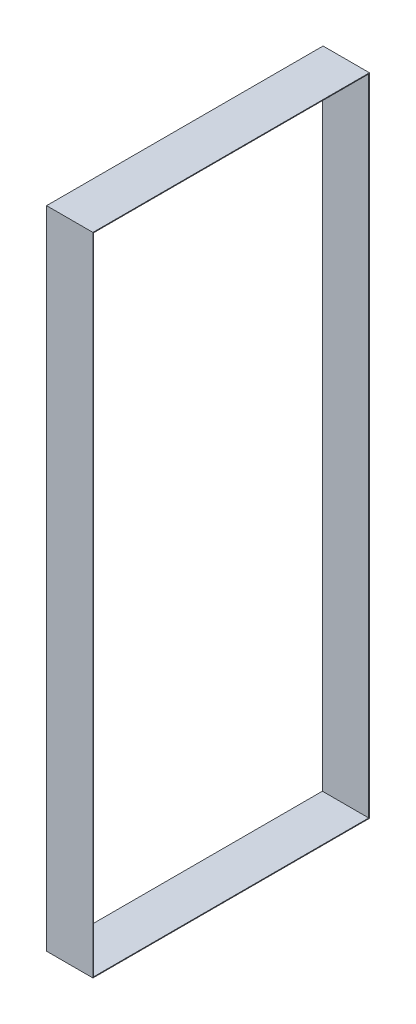
ISO-10303-21;
HEADER;
FILE_DESCRIPTION(('STEP AP214'),'2;1');
FILE_NAME('part.step','',(''),(''),'','','');
FILE_SCHEMA(('AUTOMOTIVE_DESIGN { 1 0 10303 214 1 1 1 1 }'));
ENDSEC;
DATA;
#1=APPLICATION_CONTEXT('core data for automotive mechanical design processes');
#2=APPLICATION_PROTOCOL_DEFINITION('international standard','automotive_design',2000,#1);
#3=PRODUCT_CONTEXT('',#1,'mechanical');
#4=PRODUCT('Part','Part','',(#3));
#5=PRODUCT_RELATED_PRODUCT_CATEGORY('part','',(#4));
#6=PRODUCT_DEFINITION_FORMATION('','',#4);
#7=PRODUCT_DEFINITION_CONTEXT('part definition',#1,'design');
#8=PRODUCT_DEFINITION('design','',#6,#7);
#9=PRODUCT_DEFINITION_SHAPE('','',#8);
#10=(LENGTH_UNIT() NAMED_UNIT(*) SI_UNIT(.MILLI.,.METRE.));
#11=(NAMED_UNIT(*) PLANE_ANGLE_UNIT() SI_UNIT($,.RADIAN.));
#12=(NAMED_UNIT(*) SI_UNIT($,.STERADIAN.) SOLID_ANGLE_UNIT());
#13=UNCERTAINTY_MEASURE_WITH_UNIT(LENGTH_MEASURE(1.E-05),#10,'distance_accuracy_value','');
#14=(GEOMETRIC_REPRESENTATION_CONTEXT(3) GLOBAL_UNCERTAINTY_ASSIGNED_CONTEXT((#13)) GLOBAL_UNIT_ASSIGNED_CONTEXT((#10,
#11,#12)) REPRESENTATION_CONTEXT('',''));
#15=CARTESIAN_POINT('',(0.,0.,0.));
#16=DIRECTION('',(0.,0.,1.));
#17=DIRECTION('',(1.,0.,0.));
#18=AXIS2_PLACEMENT_3D('',#15,#16,#17);
#19=CARTESIAN_POINT('',(-0.803,1.4,-0.003));
#20=DIRECTION('',(0.,0.,-1.));
#21=DIRECTION('',(0.,1.,0.));
#22=AXIS2_PLACEMENT_3D('',#19,#20,#21);
#23=PLANE('',#22);
#24=DIRECTION('',(-1.,0.,0.));
#25=VECTOR('',#24,1.);
#26=CARTESIAN_POINT('',(-0.602,1.4,-0.003));
#27=LINE('',#26,#25);
#28=CARTESIAN_POINT('',(-0.602,1.4,-0.003));
#29=VERTEX_POINT('',#28);
#30=CARTESIAN_POINT('',(-0.803,1.4,-0.003));
#31=VERTEX_POINT('',#30);
#32=EDGE_CURVE('E11',#29,#31,#27,.T.);
#33=ORIENTED_EDGE('',*,*,#32,.F.);
#34=DIRECTION('',(0.,1.,0.));
#35=VECTOR('',#34,1.);
#36=CARTESIAN_POINT('',(-0.602,-1.4,-0.003));
#37=LINE('',#36,#35);
#38=CARTESIAN_POINT('',(-0.602,-1.4,-0.003));
#39=VERTEX_POINT('',#38);
#40=EDGE_CURVE('E24',#39,#29,#37,.T.);
#41=ORIENTED_EDGE('',*,*,#40,.F.);
#42=DIRECTION('',(1.,0.,0.));
#43=VECTOR('',#42,1.);
#44=CARTESIAN_POINT('',(-0.803,-1.4,-0.003));
#45=LINE('',#44,#43);
#46=CARTESIAN_POINT('',(-0.803,-1.4,-0.003));
#47=VERTEX_POINT('',#46);
#48=EDGE_CURVE('E178',#47,#39,#45,.T.);
#49=ORIENTED_EDGE('',*,*,#48,.F.);
#50=DIRECTION('',(0.,-1.,0.));
#51=VECTOR('',#50,1.);
#52=CARTESIAN_POINT('',(-0.803,1.4,-0.003));
#53=LINE('',#52,#51);
#54=EDGE_CURVE('E175',#31,#47,#53,.T.);
#55=ORIENTED_EDGE('',*,*,#54,.F.);
#56=EDGE_LOOP('',(#33,#41,#49,#55));
#57=FACE_BOUND('',#56,.T.);
#58=ADVANCED_FACE('F17',(#57),#23,.T.);
#59=CARTESIAN_POINT('',(-0.803,-1.4,-0.003));
#60=DIRECTION('',(0.,-1.,0.));
#61=DIRECTION('',(0.,0.,1.));
#62=AXIS2_PLACEMENT_3D('',#59,#60,#61);
#63=PLANE('',#62);
#64=ORIENTED_EDGE('',*,*,#48,.T.);
#65=DIRECTION('',(0.,0.,-1.));
#66=VECTOR('',#65,1.);
#67=CARTESIAN_POINT('',(-0.602,-1.4,1.196));
#68=LINE('',#67,#66);
#69=CARTESIAN_POINT('',(-0.602,-1.4,1.196));
#70=VERTEX_POINT('',#69);
#71=EDGE_CURVE('E172',#70,#39,#68,.T.);
#72=ORIENTED_EDGE('',*,*,#71,.F.);
#73=DIRECTION('',(1.,0.,0.));
#74=VECTOR('',#73,1.);
#75=CARTESIAN_POINT('',(-0.803,-1.4,1.196));
#76=LINE('',#75,#74);
#77=CARTESIAN_POINT('',(-0.803,-1.4,1.196));
#78=VERTEX_POINT('',#77);
#79=EDGE_CURVE('E169',#78,#70,#76,.T.);
#80=ORIENTED_EDGE('',*,*,#79,.F.);
#81=DIRECTION('',(0.,0.,1.));
#82=VECTOR('',#81,1.);
#83=CARTESIAN_POINT('',(-0.803,-1.4,-0.003));
#84=LINE('',#83,#82);
#85=EDGE_CURVE('E166',#47,#78,#84,.T.);
#86=ORIENTED_EDGE('',*,*,#85,.F.);
#87=EDGE_LOOP('',(#64,#72,#80,#86));
#88=FACE_BOUND('',#87,.T.);
#89=ADVANCED_FACE('F199',(#88),#63,.T.);
#90=CARTESIAN_POINT('',(-0.602,1.4,-0.003));
#91=DIRECTION('',(0.,1.,0.));
#92=DIRECTION('',(0.,0.,1.));
#93=AXIS2_PLACEMENT_3D('',#90,#91,#92);
#94=PLANE('',#93);
#95=ORIENTED_EDGE('',*,*,#32,.T.);
#96=DIRECTION('',(0.,0.,-1.));
#97=VECTOR('',#96,1.);
#98=CARTESIAN_POINT('',(-0.803,1.4,1.196));
#99=LINE('',#98,#97);
#100=CARTESIAN_POINT('',(-0.803,1.4,1.196));
#101=VERTEX_POINT('',#100);
#102=EDGE_CURVE('E163',#101,#31,#99,.T.);
#103=ORIENTED_EDGE('',*,*,#102,.F.);
#104=DIRECTION('',(-1.,0.,0.));
#105=VECTOR('',#104,1.);
#106=CARTESIAN_POINT('',(-0.602,1.4,1.196));
#107=LINE('',#106,#105);
#108=CARTESIAN_POINT('',(-0.602,1.4,1.196));
#109=VERTEX_POINT('',#108);
#110=EDGE_CURVE('E158',#109,#101,#107,.T.);
#111=ORIENTED_EDGE('',*,*,#110,.F.);
#112=DIRECTION('',(0.,0.,1.));
#113=VECTOR('',#112,1.);
#114=CARTESIAN_POINT('',(-0.602,1.4,-0.003));
#115=LINE('',#114,#113);
#116=EDGE_CURVE('E153',#29,#109,#115,.T.);
#117=ORIENTED_EDGE('',*,*,#116,.F.);
#118=EDGE_LOOP('',(#95,#103,#111,#117));
#119=FACE_BOUND('',#118,.T.);
#120=ADVANCED_FACE('F184',(#119),#94,.T.);
#121=CARTESIAN_POINT('',(-0.803,-1.4,1.196));
#122=DIRECTION('',(0.,0.,1.));
#123=DIRECTION('',(0.,1.,0.));
#124=AXIS2_PLACEMENT_3D('',#121,#122,#123);
#125=PLANE('',#124);
#126=ORIENTED_EDGE('',*,*,#79,.T.);
#127=DIRECTION('',(0.,-1.,0.));
#128=VECTOR('',#127,1.);
#129=CARTESIAN_POINT('',(-0.602,1.4,1.196));
#130=LINE('',#129,#128);
#131=EDGE_CURVE('E148',#109,#70,#130,.T.);
#132=ORIENTED_EDGE('',*,*,#131,.F.);
#133=ORIENTED_EDGE('',*,*,#110,.T.);
#134=DIRECTION('',(0.,1.,0.));
#135=VECTOR('',#134,1.);
#136=CARTESIAN_POINT('',(-0.803,-1.4,1.196));
#137=LINE('',#136,#135);
#138=EDGE_CURVE('E146',#78,#101,#137,.T.);
#139=ORIENTED_EDGE('',*,*,#138,.F.);
#140=EDGE_LOOP('',(#126,#132,#133,#139));
#141=FACE_BOUND('',#140,.T.);
#142=ADVANCED_FACE('F187',(#141),#125,.T.);
#143=CARTESIAN_POINT('',(-0.602,-1.4,-0.003));
#144=DIRECTION('',(1.,0.,0.));
#145=DIRECTION('',(0.,0.,1.));
#146=AXIS2_PLACEMENT_3D('',#143,#144,#145);
#147=PLANE('',#146);
#148=ORIENTED_EDGE('',*,*,#40,.T.);
#149=ORIENTED_EDGE('',*,*,#116,.T.);
#150=DIRECTION('',(0.,0.707106781186548,0.707106781186548));
#151=VECTOR('',#150,1.);
#152=CARTESIAN_POINT('',(-0.602,1.397,1.194));
#153=LINE('',#152,#151);
#154=CARTESIAN_POINT('',(-0.602,1.397,1.194));
#155=VERTEX_POINT('',#154);
#156=EDGE_CURVE('E141',#155,#109,#153,.T.);
#157=ORIENTED_EDGE('',*,*,#156,.F.);
#158=DIRECTION('',(0.,0.,1.));
#159=VECTOR('',#158,1.);
#160=CARTESIAN_POINT('',(-0.602,1.397,0.));
#161=LINE('',#160,#159);
#162=CARTESIAN_POINT('',(-0.602,1.397,0.));
#163=VERTEX_POINT('',#162);
#164=EDGE_CURVE('E138',#163,#155,#161,.T.);
#165=ORIENTED_EDGE('',*,*,#164,.F.);
#166=DIRECTION('',(0.,1.,0.));
#167=VECTOR('',#166,1.);
#168=CARTESIAN_POINT('',(-0.602,-1.397,0.));
#169=LINE('',#168,#167);
#170=CARTESIAN_POINT('',(-0.602,-1.397,0.));
#171=VERTEX_POINT('',#170);
#172=EDGE_CURVE('E135',#171,#163,#169,.T.);
#173=ORIENTED_EDGE('',*,*,#172,.F.);
#174=DIRECTION('',(0.,0.707106781186548,0.707106781186548));
#175=VECTOR('',#174,1.);
#176=CARTESIAN_POINT('',(-0.602,-1.4,-0.003));
#177=LINE('',#176,#175);
#178=EDGE_CURVE('E132',#39,#171,#177,.T.);
#179=ORIENTED_EDGE('',*,*,#178,.F.);
#180=EDGE_LOOP('',(#148,#149,#157,#165,#173,#179));
#181=FACE_BOUND('',#180,.T.);
#182=ADVANCED_FACE('F182',(#181),#147,.T.);
#183=CARTESIAN_POINT('',(-0.602,-1.4,-0.003));
#184=DIRECTION('',(1.,0.,0.));
#185=DIRECTION('',(0.,0.,1.));
#186=AXIS2_PLACEMENT_3D('',#183,#184,#185);
#187=PLANE('',#186);
#188=ORIENTED_EDGE('',*,*,#178,.T.);
#189=DIRECTION('',(0.,0.,-1.));
#190=VECTOR('',#189,1.);
#191=CARTESIAN_POINT('',(-0.602,-1.397,1.194));
#192=LINE('',#191,#190);
#193=CARTESIAN_POINT('',(-0.602,-1.397,1.194));
#194=VERTEX_POINT('',#193);
#195=EDGE_CURVE('E130',#194,#171,#192,.T.);
#196=ORIENTED_EDGE('',*,*,#195,.F.);
#197=DIRECTION('',(0.,-1.,0.));
#198=VECTOR('',#197,1.);
#199=CARTESIAN_POINT('',(-0.602,1.397,1.194));
#200=LINE('',#199,#198);
#201=EDGE_CURVE('E104',#155,#194,#200,.T.);
#202=ORIENTED_EDGE('',*,*,#201,.F.);
#203=ORIENTED_EDGE('',*,*,#156,.T.);
#204=ORIENTED_EDGE('',*,*,#131,.T.);
#205=ORIENTED_EDGE('',*,*,#71,.T.);
#206=EDGE_LOOP('',(#188,#196,#202,#203,#204,#205));
#207=FACE_BOUND('',#206,.T.);
#208=ADVANCED_FACE('F197',(#207),#187,.T.);
#209=CARTESIAN_POINT('',(-0.803,1.4,-0.003));
#210=DIRECTION('',(-1.,0.,0.));
#211=DIRECTION('',(0.,0.,1.));
#212=AXIS2_PLACEMENT_3D('',#209,#210,#211);
#213=PLANE('',#212);
#214=ORIENTED_EDGE('',*,*,#54,.T.);
#215=DIRECTION('',(0.,-0.707106781186548,-0.707106781186548));
#216=VECTOR('',#215,1.);
#217=CARTESIAN_POINT('',(-0.803,-1.397,0.));
#218=LINE('',#217,#216);
#219=CARTESIAN_POINT('',(-0.803,-1.397,0.));
#220=VERTEX_POINT('',#219);
#221=EDGE_CURVE('E127',#220,#47,#218,.T.);
#222=ORIENTED_EDGE('',*,*,#221,.F.);
#223=DIRECTION('',(0.,-1.,0.));
#224=VECTOR('',#223,1.);
#225=CARTESIAN_POINT('',(-0.803,1.397,0.));
#226=LINE('',#225,#224);
#227=CARTESIAN_POINT('',(-0.803,1.397,0.));
#228=VERTEX_POINT('',#227);
#229=EDGE_CURVE('E124',#228,#220,#226,.T.);
#230=ORIENTED_EDGE('',*,*,#229,.F.);
#231=DIRECTION('',(0.,0.,-1.));
#232=VECTOR('',#231,1.);
#233=CARTESIAN_POINT('',(-0.803,1.397,1.194));
#234=LINE('',#233,#232);
#235=CARTESIAN_POINT('',(-0.803,1.397,1.194));
#236=VERTEX_POINT('',#235);
#237=EDGE_CURVE('E119',#236,#228,#234,.T.);
#238=ORIENTED_EDGE('',*,*,#237,.F.);
#239=DIRECTION('',(0.,-0.707106781186548,-0.707106781186548));
#240=VECTOR('',#239,1.);
#241=CARTESIAN_POINT('',(-0.803,1.4,1.196));
#242=LINE('',#241,#240);
#243=EDGE_CURVE('E86',#101,#236,#242,.T.);
#244=ORIENTED_EDGE('',*,*,#243,.F.);
#245=ORIENTED_EDGE('',*,*,#102,.T.);
#246=EDGE_LOOP('',(#214,#222,#230,#238,#244,#245));
#247=FACE_BOUND('',#246,.T.);
#248=ADVANCED_FACE('F190',(#247),#213,.T.);
#249=CARTESIAN_POINT('',(-0.803,-1.397,0.));
#250=DIRECTION('',(-1.,0.,0.));
#251=DIRECTION('',(0.,0.,1.));
#252=AXIS2_PLACEMENT_3D('',#249,#250,#251);
#253=PLANE('',#252);
#254=ORIENTED_EDGE('',*,*,#221,.T.);
#255=ORIENTED_EDGE('',*,*,#85,.T.);
#256=ORIENTED_EDGE('',*,*,#138,.T.);
#257=ORIENTED_EDGE('',*,*,#243,.T.);
#258=DIRECTION('',(0.,1.,0.));
#259=VECTOR('',#258,1.);
#260=CARTESIAN_POINT('',(-0.803,-1.397,1.194));
#261=LINE('',#260,#259);
#262=CARTESIAN_POINT('',(-0.803,-1.397,1.194));
#263=VERTEX_POINT('',#262);
#264=EDGE_CURVE('E78',#263,#236,#261,.T.);
#265=ORIENTED_EDGE('',*,*,#264,.F.);
#266=DIRECTION('',(0.,0.,1.));
#267=VECTOR('',#266,1.);
#268=CARTESIAN_POINT('',(-0.803,-1.397,0.));
#269=LINE('',#268,#267);
#270=EDGE_CURVE('E82',#220,#263,#269,.T.);
#271=ORIENTED_EDGE('',*,*,#270,.F.);
#272=EDGE_LOOP('',(#254,#255,#256,#257,#265,#271));
#273=FACE_BOUND('',#272,.T.);
#274=ADVANCED_FACE('F81',(#273),#253,.T.);
#275=CARTESIAN_POINT('',(-0.803,1.397,0.));
#276=DIRECTION('',(0.,-1.,0.));
#277=DIRECTION('',(0.,0.,1.));
#278=AXIS2_PLACEMENT_3D('',#275,#276,#277);
#279=PLANE('',#278);
#280=DIRECTION('',(-1.,0.,0.));
#281=VECTOR('',#280,1.);
#282=CARTESIAN_POINT('',(-0.602,1.397,0.));
#283=LINE('',#282,#281);
#284=EDGE_CURVE('E99',#163,#228,#283,.T.);
#285=ORIENTED_EDGE('',*,*,#284,.F.);
#286=ORIENTED_EDGE('',*,*,#164,.T.);
#287=DIRECTION('',(1.,0.,0.));
#288=VECTOR('',#287,1.);
#289=CARTESIAN_POINT('',(-0.803,1.397,1.194));
#290=LINE('',#289,#288);
#291=EDGE_CURVE('E106',#236,#155,#290,.T.);
#292=ORIENTED_EDGE('',*,*,#291,.F.);
#293=ORIENTED_EDGE('',*,*,#237,.T.);
#294=EDGE_LOOP('',(#285,#286,#292,#293));
#295=FACE_BOUND('',#294,.T.);
#296=ADVANCED_FACE('F193',(#295),#279,.T.);
#297=CARTESIAN_POINT('',(-0.602,-1.397,0.));
#298=DIRECTION('',(0.,1.,0.));
#299=DIRECTION('',(0.,0.,1.));
#300=AXIS2_PLACEMENT_3D('',#297,#298,#299);
#301=PLANE('',#300);
#302=DIRECTION('',(1.,0.,0.));
#303=VECTOR('',#302,1.);
#304=CARTESIAN_POINT('',(-0.803,-1.397,0.));
#305=LINE('',#304,#303);
#306=EDGE_CURVE('E98',#220,#171,#305,.T.);
#307=ORIENTED_EDGE('',*,*,#306,.F.);
#308=ORIENTED_EDGE('',*,*,#270,.T.);
#309=DIRECTION('',(-1.,0.,0.));
#310=VECTOR('',#309,1.);
#311=CARTESIAN_POINT('',(-0.602,-1.397,1.194));
#312=LINE('',#311,#310);
#313=EDGE_CURVE('E96',#194,#263,#312,.T.);
#314=ORIENTED_EDGE('',*,*,#313,.F.);
#315=ORIENTED_EDGE('',*,*,#195,.T.);
#316=EDGE_LOOP('',(#307,#308,#314,#315));
#317=FACE_BOUND('',#316,.T.);
#318=ADVANCED_FACE('F94',(#317),#301,.T.);
#319=CARTESIAN_POINT('',(-0.803,-1.397,0.));
#320=DIRECTION('',(0.,0.,1.));
#321=DIRECTION('',(0.,1.,0.));
#322=AXIS2_PLACEMENT_3D('',#319,#320,#321);
#323=PLANE('',#322);
#324=ORIENTED_EDGE('',*,*,#306,.T.);
#325=ORIENTED_EDGE('',*,*,#172,.T.);
#326=ORIENTED_EDGE('',*,*,#284,.T.);
#327=ORIENTED_EDGE('',*,*,#229,.T.);
#328=EDGE_LOOP('',(#324,#325,#326,#327));
#329=FACE_BOUND('',#328,.T.);
#330=ADVANCED_FACE('F195',(#329),#323,.T.);
#331=CARTESIAN_POINT('',(-0.602,-1.397,1.194));
#332=DIRECTION('',(0.,0.,-1.));
#333=DIRECTION('',(0.,1.,0.));
#334=AXIS2_PLACEMENT_3D('',#331,#332,#333);
#335=PLANE('',#334);
#336=ORIENTED_EDGE('',*,*,#313,.T.);
#337=ORIENTED_EDGE('',*,*,#264,.T.);
#338=ORIENTED_EDGE('',*,*,#291,.T.);
#339=ORIENTED_EDGE('',*,*,#201,.T.);
#340=EDGE_LOOP('',(#336,#337,#338,#339));
#341=FACE_BOUND('',#340,.T.);
#342=ADVANCED_FACE('F102',(#341),#335,.T.);
#343=CLOSED_SHELL('',(#58,#89,#120,#142,#182,#208,#248,#274,#296,#318,#330,#342));
#344=MANIFOLD_SOLID_BREP('B1',#343);
#345=ADVANCED_BREP_SHAPE_REPRESENTATION('',(#18,#344),#14);
#346=SHAPE_DEFINITION_REPRESENTATION(#9,#345);
ENDSEC;
END-ISO-10303-21;
